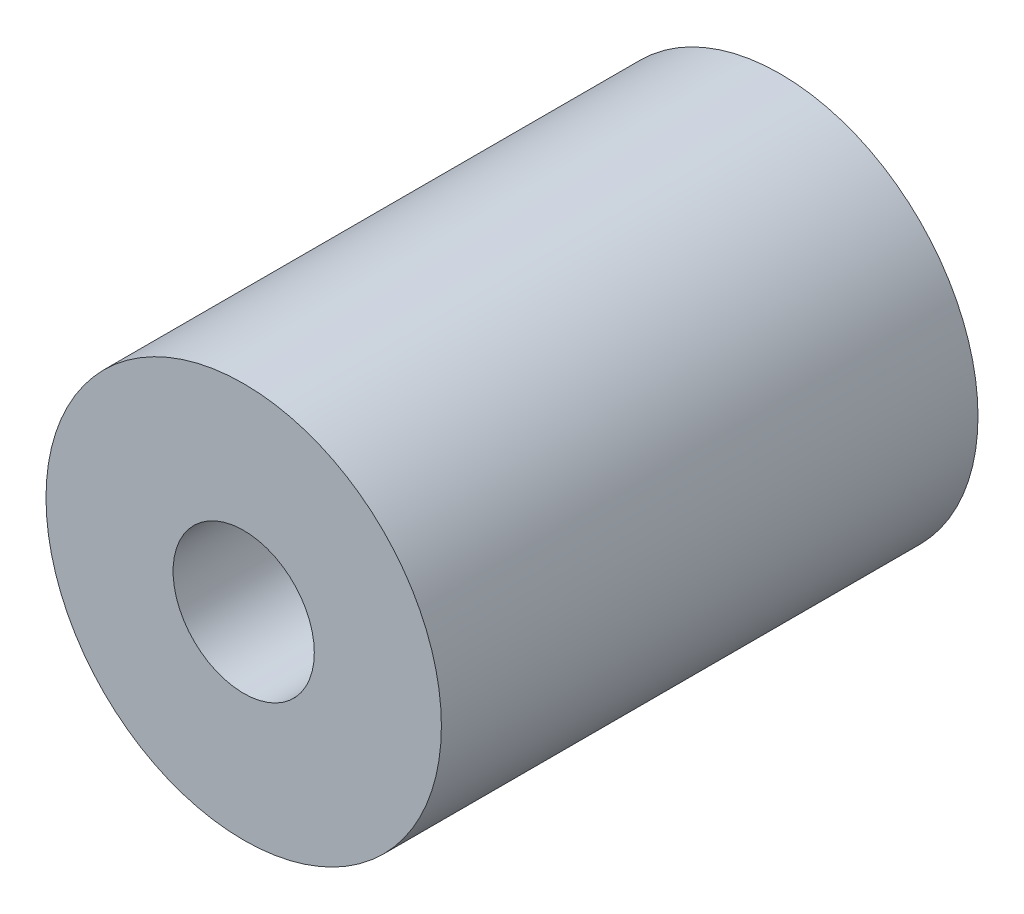
ISO-10303-21;
HEADER;
FILE_DESCRIPTION(('STEP AP214'),'2;1');
FILE_NAME('part.step','',(''),(''),'','','');
FILE_SCHEMA(('AUTOMOTIVE_DESIGN { 1 0 10303 214 1 1 1 1 }'));
ENDSEC;
DATA;
#1=APPLICATION_CONTEXT('core data for automotive mechanical design processes');
#2=APPLICATION_PROTOCOL_DEFINITION('international standard','automotive_design',2000,#1);
#3=PRODUCT_CONTEXT('',#1,'mechanical');
#4=PRODUCT('Part','Part','',(#3));
#5=PRODUCT_RELATED_PRODUCT_CATEGORY('part','',(#4));
#6=PRODUCT_DEFINITION_FORMATION('','',#4);
#7=PRODUCT_DEFINITION_CONTEXT('part definition',#1,'design');
#8=PRODUCT_DEFINITION('design','',#6,#7);
#9=PRODUCT_DEFINITION_SHAPE('','',#8);
#10=(LENGTH_UNIT() NAMED_UNIT(*) SI_UNIT(.MILLI.,.METRE.));
#11=(NAMED_UNIT(*) PLANE_ANGLE_UNIT() SI_UNIT($,.RADIAN.));
#12=(NAMED_UNIT(*) SI_UNIT($,.STERADIAN.) SOLID_ANGLE_UNIT());
#13=UNCERTAINTY_MEASURE_WITH_UNIT(LENGTH_MEASURE(1.E-05),#10,'distance_accuracy_value','');
#14=(GEOMETRIC_REPRESENTATION_CONTEXT(3) GLOBAL_UNCERTAINTY_ASSIGNED_CONTEXT((#13)) GLOBAL_UNIT_ASSIGNED_CONTEXT((#10,
#11,#12)) REPRESENTATION_CONTEXT('',''));
#15=CARTESIAN_POINT('',(0.,0.,0.));
#16=DIRECTION('',(0.,0.,1.));
#17=DIRECTION('',(1.,0.,0.));
#18=AXIS2_PLACEMENT_3D('',#15,#16,#17);
#19=CARTESIAN_POINT('',(0.,0.,38.));
#20=DIRECTION('',(0.,0.,1.));
#21=DIRECTION('',(1.,0.,0.));
#22=AXIS2_PLACEMENT_3D('',#19,#20,#21);
#23=PLANE('',#22);
#24=CARTESIAN_POINT('',(0.,0.,38.));
#25=DIRECTION('',(0.,0.,1.));
#26=DIRECTION('',(1.,0.,0.));
#27=AXIS2_PLACEMENT_3D('',#24,#25,#26);
#28=CIRCLE('',#27,14.);
#29=CARTESIAN_POINT('',(14.,0.,38.));
#30=VERTEX_POINT('',#29);
#31=EDGE_CURVE('E10',#30,#30,#28,.T.);
#32=ORIENTED_EDGE('',*,*,#31,.T.);
#33=EDGE_LOOP('',(#32));
#34=FACE_BOUND('',#33,.T.);
#35=CARTESIAN_POINT('',(0.,0.,38.));
#36=DIRECTION('',(0.,0.,1.));
#37=DIRECTION('',(1.,0.,0.));
#38=AXIS2_PLACEMENT_3D('',#35,#36,#37);
#39=CIRCLE('',#38,5.);
#40=CARTESIAN_POINT('',(5.,0.,38.));
#41=VERTEX_POINT('',#40);
#42=EDGE_CURVE('E42',#41,#41,#39,.T.);
#43=ORIENTED_EDGE('',*,*,#42,.F.);
#44=EDGE_LOOP('',(#43));
#45=FACE_BOUND('',#44,.T.);
#46=ADVANCED_FACE('F31',(#34,#45),#23,.T.);
#47=CARTESIAN_POINT('',(0.,0.,0.));
#48=DIRECTION('',(0.,0.,1.));
#49=DIRECTION('',(1.,0.,0.));
#50=AXIS2_PLACEMENT_3D('',#47,#48,#49);
#51=PLANE('',#50);
#52=CARTESIAN_POINT('',(0.,0.,0.));
#53=DIRECTION('',(0.,0.,1.));
#54=DIRECTION('',(1.,0.,0.));
#55=AXIS2_PLACEMENT_3D('',#52,#53,#54);
#56=CIRCLE('',#55,14.);
#57=CARTESIAN_POINT('',(14.,0.,0.));
#58=VERTEX_POINT('',#57);
#59=EDGE_CURVE('E35',#58,#58,#56,.T.);
#60=ORIENTED_EDGE('',*,*,#59,.F.);
#61=EDGE_LOOP('',(#60));
#62=FACE_BOUND('',#61,.T.);
#63=CARTESIAN_POINT('',(0.,0.,0.));
#64=DIRECTION('',(0.,0.,1.));
#65=DIRECTION('',(1.,0.,0.));
#66=AXIS2_PLACEMENT_3D('',#63,#64,#65);
#67=CIRCLE('',#66,5.);
#68=CARTESIAN_POINT('',(5.,0.,0.));
#69=VERTEX_POINT('',#68);
#70=EDGE_CURVE('E44',#69,#69,#67,.T.);
#71=ORIENTED_EDGE('',*,*,#70,.T.);
#72=EDGE_LOOP('',(#71));
#73=FACE_BOUND('',#72,.T.);
#74=ADVANCED_FACE('F54',(#62,#73),#51,.F.);
#75=CARTESIAN_POINT('',(0.,0.,38.));
#76=DIRECTION('',(0.,0.,-1.));
#77=DIRECTION('',(-1.,0.,0.));
#78=AXIS2_PLACEMENT_3D('',#75,#76,#77);
#79=CYLINDRICAL_SURFACE('',#78,14.);
#80=ORIENTED_EDGE('',*,*,#31,.F.);
#81=EDGE_LOOP('',(#80));
#82=FACE_BOUND('',#81,.T.);
#83=ORIENTED_EDGE('',*,*,#59,.T.);
#84=EDGE_LOOP('',(#83));
#85=FACE_BOUND('',#84,.T.);
#86=ADVANCED_FACE('F33',(#82,#85),#79,.T.);
#87=CARTESIAN_POINT('',(0.,0.,38.));
#88=DIRECTION('',(0.,0.,-1.));
#89=DIRECTION('',(-1.,0.,0.));
#90=AXIS2_PLACEMENT_3D('',#87,#88,#89);
#91=CYLINDRICAL_SURFACE('',#90,5.);
#92=ORIENTED_EDGE('',*,*,#42,.T.);
#93=EDGE_LOOP('',(#92));
#94=FACE_BOUND('',#93,.T.);
#95=ORIENTED_EDGE('',*,*,#70,.F.);
#96=EDGE_LOOP('',(#95));
#97=FACE_BOUND('',#96,.T.);
#98=ADVANCED_FACE('F50',(#94,#97),#91,.F.);
#99=CLOSED_SHELL('',(#46,#74,#86,#98));
#100=MANIFOLD_SOLID_BREP('B2',#99);
#101=ADVANCED_BREP_SHAPE_REPRESENTATION('',(#18,#100),#14);
#102=SHAPE_DEFINITION_REPRESENTATION(#9,#101);
ENDSEC;
END-ISO-10303-21;
